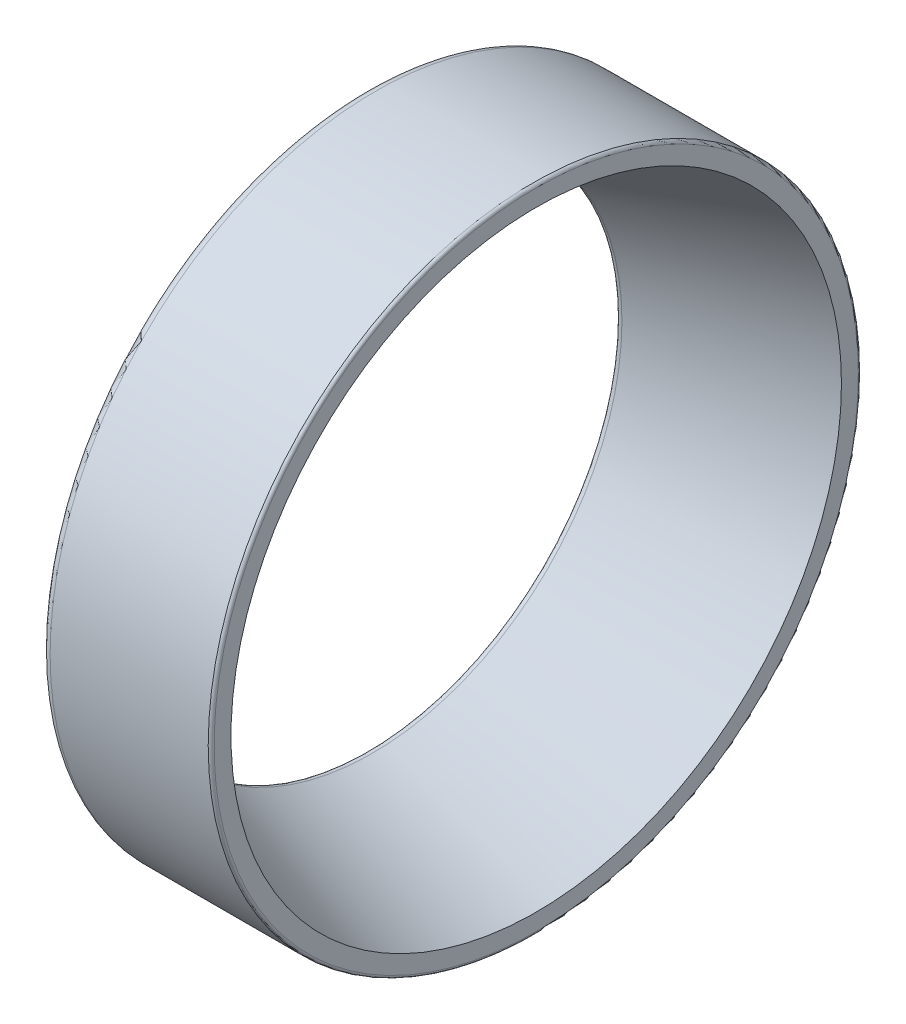
ISO-10303-21;
HEADER;
FILE_DESCRIPTION(('STEP AP214'),'2;1');
FILE_NAME('part.step','',(''),(''),'','','');
FILE_SCHEMA(('AUTOMOTIVE_DESIGN { 1 0 10303 214 1 1 1 1 }'));
ENDSEC;
DATA;
#1=APPLICATION_CONTEXT('core data for automotive mechanical design processes');
#2=APPLICATION_PROTOCOL_DEFINITION('international standard','automotive_design',2000,#1);
#3=PRODUCT_CONTEXT('',#1,'mechanical');
#4=PRODUCT('Part','Part','',(#3));
#5=PRODUCT_RELATED_PRODUCT_CATEGORY('part','',(#4));
#6=PRODUCT_DEFINITION_FORMATION('','',#4);
#7=PRODUCT_DEFINITION_CONTEXT('part definition',#1,'design');
#8=PRODUCT_DEFINITION('design','',#6,#7);
#9=PRODUCT_DEFINITION_SHAPE('','',#8);
#10=(LENGTH_UNIT() NAMED_UNIT(*) SI_UNIT(.MILLI.,.METRE.));
#11=(NAMED_UNIT(*) PLANE_ANGLE_UNIT() SI_UNIT($,.RADIAN.));
#12=(NAMED_UNIT(*) SI_UNIT($,.STERADIAN.) SOLID_ANGLE_UNIT());
#13=UNCERTAINTY_MEASURE_WITH_UNIT(LENGTH_MEASURE(1.E-05),#10,'distance_accuracy_value','');
#14=(GEOMETRIC_REPRESENTATION_CONTEXT(3) GLOBAL_UNCERTAINTY_ASSIGNED_CONTEXT((#13)) GLOBAL_UNIT_ASSIGNED_CONTEXT((#10,
#11,#12)) REPRESENTATION_CONTEXT('',''));
#15=CARTESIAN_POINT('',(0.,0.,0.));
#16=DIRECTION('',(0.,0.,1.));
#17=DIRECTION('',(1.,0.,0.));
#18=AXIS2_PLACEMENT_3D('',#15,#16,#17);
#19=CARTESIAN_POINT('',(0.299999999999998,0.,0.));
#20=DIRECTION('',(1.,0.,0.));
#21=DIRECTION('',(0.,0.,-1.));
#22=AXIS2_PLACEMENT_3D('',#19,#20,#21);
#23=TOROIDAL_SURFACE('',#22,17.1905768497,0.3);
#24=CARTESIAN_POINT('',(0.,0.,0.));
#25=DIRECTION('',(-1.,0.,0.));
#26=DIRECTION('',(0.,0.,-1.));
#27=AXIS2_PLACEMENT_3D('',#24,#25,#26);
#28=CIRCLE('',#27,17.1905768497124);
#29=CARTESIAN_POINT('',(0.,0.,-17.1905768497124));
#30=VERTEX_POINT('',#29);
#31=EDGE_CURVE('E65',#30,#30,#28,.F.);
#32=ORIENTED_EDGE('',*,*,#31,.F.);
#33=EDGE_LOOP('',(#32));
#34=FACE_BOUND('',#33,.T.);
#35=CARTESIAN_POINT('',(0.396015254467461,0.,0.));
#36=DIRECTION('',(1.,0.,0.));
#37=DIRECTION('',(0.,0.,-1.));
#38=AXIS2_PLACEMENT_3D('',#35,#36,#37);
#39=CIRCLE('',#38,16.9063567397949);
#40=CARTESIAN_POINT('',(0.396015254467464,0.,-16.9063567397949));
#41=VERTEX_POINT('',#40);
#42=EDGE_CURVE('E100',#41,#41,#39,.T.);
#43=ORIENTED_EDGE('',*,*,#42,.T.);
#44=EDGE_LOOP('',(#43));
#45=FACE_BOUND('',#44,.T.);
#46=ADVANCED_FACE('F13',(#34,#45),#23,.T.);
#47=CARTESIAN_POINT('',(11.4999999998997,0.,0.));
#48=DIRECTION('',(1.,0.,0.));
#49=DIRECTION('',(0.,0.,-1.));
#50=AXIS2_PLACEMENT_3D('',#47,#48,#49);
#51=CONICAL_SURFACE('',#50,20.6575055284056,0.3257831582);
#52=ORIENTED_EDGE('',*,*,#42,.F.);
#53=EDGE_LOOP('',(#52));
#54=FACE_BOUND('',#53,.T.);
#55=CARTESIAN_POINT('',(11.4999999998997,0.,0.));
#56=DIRECTION('',(1.,0.,0.));
#57=DIRECTION('',(0.,0.,-1.));
#58=AXIS2_PLACEMENT_3D('',#55,#56,#57);
#59=CIRCLE('',#58,20.6575055284056);
#60=CARTESIAN_POINT('',(11.4999999998997,0.,-20.6575055284056));
#61=VERTEX_POINT('',#60);
#62=EDGE_CURVE('E18',#61,#61,#59,.F.);
#63=ORIENTED_EDGE('',*,*,#62,.F.);
#64=EDGE_LOOP('',(#63));
#65=FACE_BOUND('',#64,.T.);
#66=ADVANCED_FACE('F81',(#54,#65),#51,.F.);
#67=CARTESIAN_POINT('',(0.,21.4,0.));
#68=DIRECTION('',(-1.,0.,0.));
#69=DIRECTION('',(0.,0.,1.));
#70=AXIS2_PLACEMENT_3D('',#67,#68,#69);
#71=PLANE('',#70);
#72=CARTESIAN_POINT('',(0.,0.,0.));
#73=DIRECTION('',(1.,0.,0.));
#74=DIRECTION('',(0.,0.,-1.));
#75=AXIS2_PLACEMENT_3D('',#72,#73,#74);
#76=CIRCLE('',#75,21.4);
#77=CARTESIAN_POINT('',(0.,0.,-21.4));
#78=VERTEX_POINT('',#77);
#79=EDGE_CURVE('E96',#78,#78,#76,.T.);
#80=ORIENTED_EDGE('',*,*,#79,.F.);
#81=EDGE_LOOP('',(#80));
#82=FACE_BOUND('',#81,.T.);
#83=ORIENTED_EDGE('',*,*,#31,.T.);
#84=EDGE_LOOP('',(#83));
#85=FACE_BOUND('',#84,.T.);
#86=ADVANCED_FACE('F72',(#82,#85),#71,.T.);
#87=CARTESIAN_POINT('',(11.5,20.6575055281088,0.));
#88=DIRECTION('',(1.,0.,0.));
#89=DIRECTION('',(0.,0.,-1.));
#90=AXIS2_PLACEMENT_3D('',#87,#88,#89);
#91=PLANE('',#90);
#92=ORIENTED_EDGE('',*,*,#62,.T.);
#93=EDGE_LOOP('',(#92));
#94=FACE_BOUND('',#93,.T.);
#95=CARTESIAN_POINT('',(11.5,0.,0.));
#96=DIRECTION('',(-1.,0.,0.));
#97=DIRECTION('',(0.,0.,-1.));
#98=AXIS2_PLACEMENT_3D('',#95,#96,#97);
#99=CIRCLE('',#98,21.8);
#100=CARTESIAN_POINT('',(11.5,0.,-21.8));
#101=VERTEX_POINT('',#100);
#102=EDGE_CURVE('E27',#101,#101,#99,.T.);
#103=ORIENTED_EDGE('',*,*,#102,.F.);
#104=EDGE_LOOP('',(#103));
#105=FACE_BOUND('',#104,.T.);
#106=ADVANCED_FACE('F80',(#94,#105),#91,.T.);
#107=CARTESIAN_POINT('',(0.599999999999999,0.,0.));
#108=DIRECTION('',(1.,0.,0.));
#109=DIRECTION('',(0.,0.,-1.));
#110=AXIS2_PLACEMENT_3D('',#107,#108,#109);
#111=TOROIDAL_SURFACE('',#110,21.4,0.6);
#112=CARTESIAN_POINT('',(0.6,0.,0.));
#113=DIRECTION('',(-1.,0.,0.));
#114=DIRECTION('',(0.,0.,1.));
#115=AXIS2_PLACEMENT_3D('',#112,#113,#114);
#116=CIRCLE('',#115,22.);
#117=CARTESIAN_POINT('',(0.6,0.,22.));
#118=VERTEX_POINT('',#117);
#119=EDGE_CURVE('E22',#118,#118,#116,.F.);
#120=ORIENTED_EDGE('',*,*,#119,.F.);
#121=EDGE_LOOP('',(#120));
#122=FACE_BOUND('',#121,.T.);
#123=ORIENTED_EDGE('',*,*,#79,.T.);
#124=EDGE_LOOP('',(#123));
#125=FACE_BOUND('',#124,.T.);
#126=ADVANCED_FACE('F45',(#122,#125),#111,.T.);
#127=CARTESIAN_POINT('',(11.3,0.,0.));
#128=DIRECTION('',(1.,0.,0.));
#129=DIRECTION('',(0.,0.,-1.));
#130=AXIS2_PLACEMENT_3D('',#127,#128,#129);
#131=TOROIDAL_SURFACE('',#130,21.8,0.2);
#132=ORIENTED_EDGE('',*,*,#102,.T.);
#133=EDGE_LOOP('',(#132));
#134=FACE_BOUND('',#133,.T.);
#135=CARTESIAN_POINT('',(11.3,0.,0.));
#136=DIRECTION('',(-1.,0.,0.));
#137=DIRECTION('',(0.,0.,1.));
#138=AXIS2_PLACEMENT_3D('',#135,#136,#137);
#139=CIRCLE('',#138,22.);
#140=CARTESIAN_POINT('',(11.3,0.,22.));
#141=VERTEX_POINT('',#140);
#142=EDGE_CURVE('E9',#141,#141,#139,.T.);
#143=ORIENTED_EDGE('',*,*,#142,.F.);
#144=EDGE_LOOP('',(#143));
#145=FACE_BOUND('',#144,.T.);
#146=ADVANCED_FACE('F39',(#134,#145),#131,.T.);
#147=CARTESIAN_POINT('',(11.5,0.,0.));
#148=DIRECTION('',(-1.,0.,0.));
#149=DIRECTION('',(0.,0.,1.));
#150=AXIS2_PLACEMENT_3D('',#147,#148,#149);
#151=CYLINDRICAL_SURFACE('',#150,22.);
#152=ORIENTED_EDGE('',*,*,#142,.T.);
#153=EDGE_LOOP('',(#152));
#154=FACE_BOUND('',#153,.T.);
#155=ORIENTED_EDGE('',*,*,#119,.T.);
#156=EDGE_LOOP('',(#155));
#157=FACE_BOUND('',#156,.T.);
#158=ADVANCED_FACE('F44',(#154,#157),#151,.T.);
#159=CLOSED_SHELL('',(#46,#66,#86,#106,#126,#146,#158));
#160=MANIFOLD_SOLID_BREP('B1',#159);
#161=ADVANCED_BREP_SHAPE_REPRESENTATION('',(#18,#160),#14);
#162=SHAPE_DEFINITION_REPRESENTATION(#9,#161);
ENDSEC;
END-ISO-10303-21;
